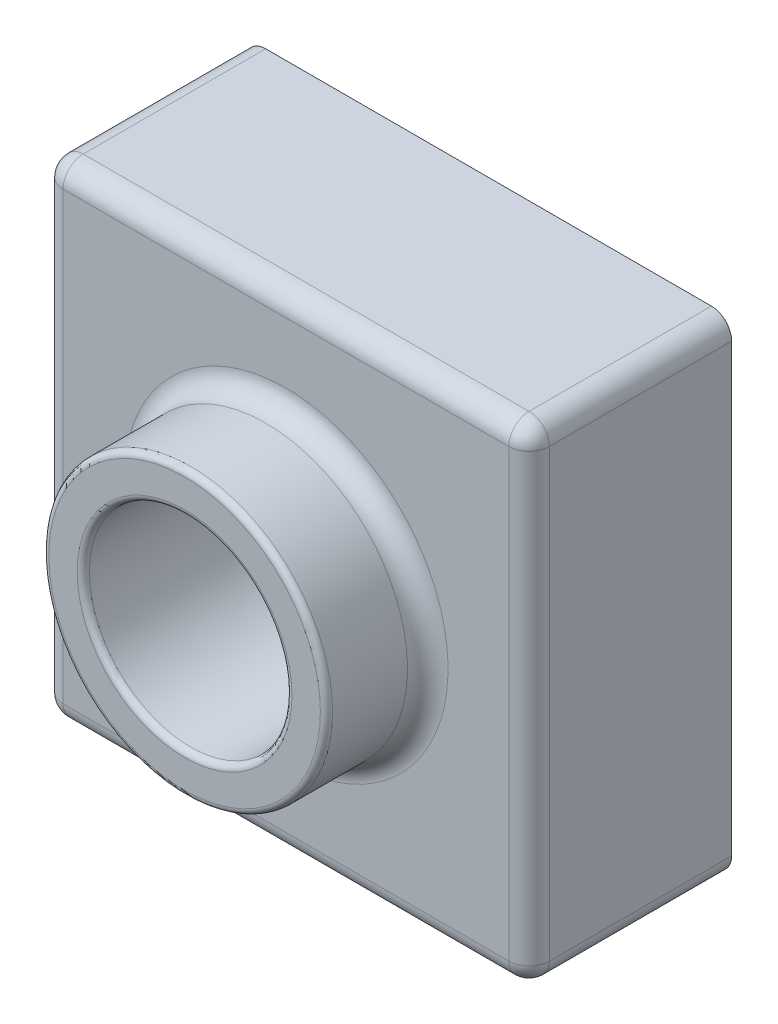
ISO-10303-21;
HEADER;
FILE_DESCRIPTION(('STEP AP214'),'2;1');
FILE_NAME('part.step','',(''),(''),'','','');
FILE_SCHEMA(('AUTOMOTIVE_DESIGN { 1 0 10303 214 1 1 1 1 }'));
ENDSEC;
DATA;
#1=APPLICATION_CONTEXT('core data for automotive mechanical design processes');
#2=APPLICATION_PROTOCOL_DEFINITION('international standard','automotive_design',2000,#1);
#3=PRODUCT_CONTEXT('',#1,'mechanical');
#4=PRODUCT('Part','Part','',(#3));
#5=PRODUCT_RELATED_PRODUCT_CATEGORY('part','',(#4));
#6=PRODUCT_DEFINITION_FORMATION('','',#4);
#7=PRODUCT_DEFINITION_CONTEXT('part definition',#1,'design');
#8=PRODUCT_DEFINITION('design','',#6,#7);
#9=PRODUCT_DEFINITION_SHAPE('','',#8);
#10=(LENGTH_UNIT() NAMED_UNIT(*) SI_UNIT(.MILLI.,.METRE.));
#11=(NAMED_UNIT(*) PLANE_ANGLE_UNIT() SI_UNIT($,.RADIAN.));
#12=(NAMED_UNIT(*) SI_UNIT($,.STERADIAN.) SOLID_ANGLE_UNIT());
#13=UNCERTAINTY_MEASURE_WITH_UNIT(LENGTH_MEASURE(1.E-05),#10,'distance_accuracy_value','');
#14=(GEOMETRIC_REPRESENTATION_CONTEXT(3) GLOBAL_UNCERTAINTY_ASSIGNED_CONTEXT((#13)) GLOBAL_UNIT_ASSIGNED_CONTEXT((#10,
#11,#12)) REPRESENTATION_CONTEXT('',''));
#15=CARTESIAN_POINT('',(0.,0.,0.));
#16=DIRECTION('',(0.,0.,1.));
#17=DIRECTION('',(1.,0.,0.));
#18=AXIS2_PLACEMENT_3D('',#15,#16,#17);
#19=CARTESIAN_POINT('',(0.,0.,50.));
#20=DIRECTION('',(0.,0.,-1.));
#21=DIRECTION('',(-1.,0.,0.));
#22=AXIS2_PLACEMENT_3D('',#19,#20,#21);
#23=PLANE('',#22);
#24=DIRECTION('',(0.,1.,0.));
#25=VECTOR('',#24,1.);
#26=CARTESIAN_POINT('',(115.,0.,50.));
#27=LINE('',#26,#25);
#28=CARTESIAN_POINT('',(115.,5.,50.));
#29=VERTEX_POINT('',#28);
#30=CARTESIAN_POINT('',(115.,115.,50.));
#31=VERTEX_POINT('',#30);
#32=EDGE_CURVE('E143',#29,#31,#27,.T.);
#33=ORIENTED_EDGE('',*,*,#32,.T.);
#34=DIRECTION('',(-1.,0.,0.));
#35=VECTOR('',#34,1.);
#36=CARTESIAN_POINT('',(0.,115.,50.));
#37=LINE('',#36,#35);
#38=CARTESIAN_POINT('',(4.99999999999997,115.,50.));
#39=VERTEX_POINT('',#38);
#40=EDGE_CURVE('E115',#31,#39,#37,.T.);
#41=ORIENTED_EDGE('',*,*,#40,.T.);
#42=DIRECTION('',(0.,-1.,0.));
#43=VECTOR('',#42,1.);
#44=CARTESIAN_POINT('',(5.,0.,50.));
#45=LINE('',#44,#43);
#46=CARTESIAN_POINT('',(5.,5.,50.));
#47=VERTEX_POINT('',#46);
#48=EDGE_CURVE('E132',#39,#47,#45,.T.);
#49=ORIENTED_EDGE('',*,*,#48,.T.);
#50=DIRECTION('',(1.,0.,0.));
#51=VECTOR('',#50,1.);
#52=CARTESIAN_POINT('',(0.,5.,50.));
#53=LINE('',#52,#51);
#54=EDGE_CURVE('E138',#47,#29,#53,.T.);
#55=ORIENTED_EDGE('',*,*,#54,.T.);
#56=EDGE_LOOP('',(#33,#41,#49,#55));
#57=FACE_BOUND('',#56,.T.);
#58=CARTESIAN_POINT('',(60.,60.,50.));
#59=DIRECTION('',(0.,0.,-1.));
#60=DIRECTION('',(-1.,0.,0.));
#61=AXIS2_PLACEMENT_3D('',#58,#59,#60);
#62=CIRCLE('',#61,40.);
#63=CARTESIAN_POINT('',(20.,60.,50.));
#64=VERTEX_POINT('',#63);
#65=EDGE_CURVE('E139',#64,#64,#62,.T.);
#66=ORIENTED_EDGE('',*,*,#65,.T.);
#67=EDGE_LOOP('',(#66));
#68=FACE_BOUND('',#67,.T.);
#69=ADVANCED_FACE('F33',(#57,#68),#23,.F.);
#70=CARTESIAN_POINT('',(0.,0.,50.));
#71=DIRECTION('',(1.,0.,0.));
#72=DIRECTION('',(0.,1.,0.));
#73=AXIS2_PLACEMENT_3D('',#70,#71,#72);
#74=PLANE('',#73);
#75=DIRECTION('',(0.,-1.,0.));
#76=VECTOR('',#75,1.);
#77=CARTESIAN_POINT('',(0.,0.,0.));
#78=LINE('',#77,#76);
#79=CARTESIAN_POINT('',(0.,115.,0.));
#80=VERTEX_POINT('',#79);
#81=CARTESIAN_POINT('',(0.,5.,0.));
#82=VERTEX_POINT('',#81);
#83=EDGE_CURVE('E240',#80,#82,#78,.T.);
#84=ORIENTED_EDGE('',*,*,#83,.T.);
#85=DIRECTION('',(0.,0.,-1.));
#86=VECTOR('',#85,1.);
#87=CARTESIAN_POINT('',(0.,5.,50.));
#88=LINE('',#87,#86);
#89=CARTESIAN_POINT('',(0.,5.,45.));
#90=VERTEX_POINT('',#89);
#91=EDGE_CURVE('E48',#82,#90,#88,.F.);
#92=ORIENTED_EDGE('',*,*,#91,.T.);
#93=DIRECTION('',(0.,-1.,0.));
#94=VECTOR('',#93,1.);
#95=CARTESIAN_POINT('',(0.,0.,45.));
#96=LINE('',#95,#94);
#97=CARTESIAN_POINT('',(0.,115.,45.));
#98=VERTEX_POINT('',#97);
#99=EDGE_CURVE('E53',#90,#98,#96,.F.);
#100=ORIENTED_EDGE('',*,*,#99,.T.);
#101=DIRECTION('',(0.,0.,-1.));
#102=VECTOR('',#101,1.);
#103=CARTESIAN_POINT('',(0.,115.,50.));
#104=LINE('',#103,#102);
#105=EDGE_CURVE('E166',#98,#80,#104,.T.);
#106=ORIENTED_EDGE('',*,*,#105,.T.);
#107=EDGE_LOOP('',(#84,#92,#100,#106));
#108=FACE_BOUND('',#107,.T.);
#109=ADVANCED_FACE('F283',(#108),#74,.F.);
#110=CARTESIAN_POINT('',(0.,0.,50.));
#111=DIRECTION('',(0.,1.,0.));
#112=DIRECTION('',(0.,0.,1.));
#113=AXIS2_PLACEMENT_3D('',#110,#111,#112);
#114=PLANE('',#113);
#115=DIRECTION('',(1.,0.,0.));
#116=VECTOR('',#115,1.);
#117=CARTESIAN_POINT('',(0.,0.,45.));
#118=LINE('',#117,#116);
#119=CARTESIAN_POINT('',(115.,0.,45.));
#120=VERTEX_POINT('',#119);
#121=CARTESIAN_POINT('',(5.,0.,45.));
#122=VERTEX_POINT('',#121);
#123=EDGE_CURVE('E162',#120,#122,#118,.F.);
#124=ORIENTED_EDGE('',*,*,#123,.T.);
#125=DIRECTION('',(0.,0.,-1.));
#126=VECTOR('',#125,1.);
#127=CARTESIAN_POINT('',(5.,0.,50.));
#128=LINE('',#127,#126);
#129=CARTESIAN_POINT('',(5.,0.,0.));
#130=VERTEX_POINT('',#129);
#131=EDGE_CURVE('E164',#122,#130,#128,.T.);
#132=ORIENTED_EDGE('',*,*,#131,.T.);
#133=DIRECTION('',(1.,0.,0.));
#134=VECTOR('',#133,1.);
#135=CARTESIAN_POINT('',(0.,0.,0.));
#136=LINE('',#135,#134);
#137=CARTESIAN_POINT('',(115.,0.,0.));
#138=VERTEX_POINT('',#137);
#139=EDGE_CURVE('E242',#130,#138,#136,.T.);
#140=ORIENTED_EDGE('',*,*,#139,.T.);
#141=DIRECTION('',(0.,0.,-1.));
#142=VECTOR('',#141,1.);
#143=CARTESIAN_POINT('',(115.,0.,50.));
#144=LINE('',#143,#142);
#145=EDGE_CURVE('E160',#138,#120,#144,.F.);
#146=ORIENTED_EDGE('',*,*,#145,.T.);
#147=EDGE_LOOP('',(#124,#132,#140,#146));
#148=FACE_BOUND('',#147,.T.);
#149=ADVANCED_FACE('F306',(#148),#114,.F.);
#150=CARTESIAN_POINT('',(120.,0.,50.));
#151=DIRECTION('',(-1.,0.,0.));
#152=DIRECTION('',(0.,-1.,0.));
#153=AXIS2_PLACEMENT_3D('',#150,#151,#152);
#154=PLANE('',#153);
#155=DIRECTION('',(0.,1.,0.));
#156=VECTOR('',#155,1.);
#157=CARTESIAN_POINT('',(120.,0.,45.));
#158=LINE('',#157,#156);
#159=CARTESIAN_POINT('',(120.,115.,45.));
#160=VERTEX_POINT('',#159);
#161=CARTESIAN_POINT('',(120.,5.,45.));
#162=VERTEX_POINT('',#161);
#163=EDGE_CURVE('E156',#160,#162,#158,.F.);
#164=ORIENTED_EDGE('',*,*,#163,.T.);
#165=DIRECTION('',(0.,0.,-1.));
#166=VECTOR('',#165,1.);
#167=CARTESIAN_POINT('',(120.,5.,50.));
#168=LINE('',#167,#166);
#169=CARTESIAN_POINT('',(120.,5.,0.));
#170=VERTEX_POINT('',#169);
#171=EDGE_CURVE('E158',#162,#170,#168,.T.);
#172=ORIENTED_EDGE('',*,*,#171,.T.);
#173=DIRECTION('',(0.,1.,0.));
#174=VECTOR('',#173,1.);
#175=CARTESIAN_POINT('',(120.,0.,0.));
#176=LINE('',#175,#174);
#177=CARTESIAN_POINT('',(120.,115.,0.));
#178=VERTEX_POINT('',#177);
#179=EDGE_CURVE('E247',#170,#178,#176,.T.);
#180=ORIENTED_EDGE('',*,*,#179,.T.);
#181=DIRECTION('',(0.,0.,-1.));
#182=VECTOR('',#181,1.);
#183=CARTESIAN_POINT('',(120.,115.,50.));
#184=LINE('',#183,#182);
#185=EDGE_CURVE('E154',#178,#160,#184,.F.);
#186=ORIENTED_EDGE('',*,*,#185,.T.);
#187=EDGE_LOOP('',(#164,#172,#180,#186));
#188=FACE_BOUND('',#187,.T.);
#189=ADVANCED_FACE('F314',(#188),#154,.F.);
#190=CARTESIAN_POINT('',(0.,120.,50.));
#191=DIRECTION('',(0.,-1.,0.));
#192=DIRECTION('',(0.,0.,-1.));
#193=AXIS2_PLACEMENT_3D('',#190,#191,#192);
#194=PLANE('',#193);
#195=DIRECTION('',(-1.,0.,0.));
#196=VECTOR('',#195,1.);
#197=CARTESIAN_POINT('',(0.,120.,45.));
#198=LINE('',#197,#196);
#199=CARTESIAN_POINT('',(4.99999999999997,120.,45.));
#200=VERTEX_POINT('',#199);
#201=CARTESIAN_POINT('',(115.,120.,45.));
#202=VERTEX_POINT('',#201);
#203=EDGE_CURVE('E117',#200,#202,#198,.F.);
#204=ORIENTED_EDGE('',*,*,#203,.T.);
#205=DIRECTION('',(0.,0.,-1.));
#206=VECTOR('',#205,1.);
#207=CARTESIAN_POINT('',(115.,120.,50.));
#208=LINE('',#207,#206);
#209=CARTESIAN_POINT('',(115.,120.,0.));
#210=VERTEX_POINT('',#209);
#211=EDGE_CURVE('E152',#202,#210,#208,.T.);
#212=ORIENTED_EDGE('',*,*,#211,.T.);
#213=DIRECTION('',(-1.,0.,0.));
#214=VECTOR('',#213,1.);
#215=CARTESIAN_POINT('',(0.,120.,0.));
#216=LINE('',#215,#214);
#217=CARTESIAN_POINT('',(4.99999999999997,120.,0.));
#218=VERTEX_POINT('',#217);
#219=EDGE_CURVE('E250',#210,#218,#216,.T.);
#220=ORIENTED_EDGE('',*,*,#219,.T.);
#221=DIRECTION('',(0.,0.,-1.));
#222=VECTOR('',#221,1.);
#223=CARTESIAN_POINT('',(4.99999999999997,120.,50.));
#224=LINE('',#223,#222);
#225=EDGE_CURVE('E145',#218,#200,#224,.F.);
#226=ORIENTED_EDGE('',*,*,#225,.T.);
#227=EDGE_LOOP('',(#204,#212,#220,#226));
#228=FACE_BOUND('',#227,.T.);
#229=ADVANCED_FACE('F277',(#228),#194,.F.);
#230=CARTESIAN_POINT('',(0.,0.,0.));
#231=DIRECTION('',(0.,0.,-1.));
#232=DIRECTION('',(-1.,0.,0.));
#233=AXIS2_PLACEMENT_3D('',#230,#231,#232);
#234=PLANE('',#233);
#235=CARTESIAN_POINT('',(60.,60.,0.));
#236=DIRECTION('',(0.,0.,1.));
#237=DIRECTION('',(1.,0.,0.));
#238=AXIS2_PLACEMENT_3D('',#235,#236,#237);
#239=CIRCLE('',#238,25.);
#240=CARTESIAN_POINT('',(85.,60.,0.));
#241=VERTEX_POINT('',#240);
#242=EDGE_CURVE('E205',#241,#241,#239,.T.);
#243=ORIENTED_EDGE('',*,*,#242,.T.);
#244=EDGE_LOOP('',(#243));
#245=FACE_BOUND('',#244,.T.);
#246=ORIENTED_EDGE('',*,*,#139,.F.);
#247=CARTESIAN_POINT('',(5.,5.,0.));
#248=DIRECTION('',(0.,0.,-1.));
#249=DIRECTION('',(-1.,0.,0.));
#250=AXIS2_PLACEMENT_3D('',#247,#248,#249);
#251=CIRCLE('',#250,5.);
#252=EDGE_CURVE('E176',#130,#82,#251,.T.);
#253=ORIENTED_EDGE('',*,*,#252,.T.);
#254=ORIENTED_EDGE('',*,*,#83,.F.);
#255=CARTESIAN_POINT('',(4.99999999999997,115.,0.));
#256=DIRECTION('',(0.,0.,-1.));
#257=DIRECTION('',(-1.,0.,0.));
#258=AXIS2_PLACEMENT_3D('',#255,#256,#257);
#259=CIRCLE('',#258,5.);
#260=EDGE_CURVE('E170',#80,#218,#259,.T.);
#261=ORIENTED_EDGE('',*,*,#260,.T.);
#262=ORIENTED_EDGE('',*,*,#219,.F.);
#263=CARTESIAN_POINT('',(115.,115.,0.));
#264=DIRECTION('',(0.,0.,-1.));
#265=DIRECTION('',(-1.,0.,0.));
#266=AXIS2_PLACEMENT_3D('',#263,#264,#265);
#267=CIRCLE('',#266,5.);
#268=EDGE_CURVE('E172',#210,#178,#267,.T.);
#269=ORIENTED_EDGE('',*,*,#268,.T.);
#270=ORIENTED_EDGE('',*,*,#179,.F.);
#271=CARTESIAN_POINT('',(115.,5.,0.));
#272=DIRECTION('',(0.,0.,-1.));
#273=DIRECTION('',(-1.,0.,0.));
#274=AXIS2_PLACEMENT_3D('',#271,#272,#273);
#275=CIRCLE('',#274,5.);
#276=EDGE_CURVE('E174',#170,#138,#275,.T.);
#277=ORIENTED_EDGE('',*,*,#276,.T.);
#278=EDGE_LOOP('',(#246,#253,#254,#261,#262,#269,#270,#277));
#279=FACE_BOUND('',#278,.T.);
#280=ADVANCED_FACE('F286',(#245,#279),#234,.T.);
#281=CARTESIAN_POINT('',(60.,60.,75.));
#282=DIRECTION('',(0.,0.,-1.));
#283=DIRECTION('',(-1.,0.,0.));
#284=AXIS2_PLACEMENT_3D('',#281,#282,#283);
#285=CYLINDRICAL_SURFACE('',#284,35.);
#286=CARTESIAN_POINT('',(60.,60.,73.5));
#287=DIRECTION('',(0.,0.,1.));
#288=DIRECTION('',(1.,0.,0.));
#289=AXIS2_PLACEMENT_3D('',#286,#287,#288);
#290=CIRCLE('',#289,35.);
#291=CARTESIAN_POINT('',(95.,60.,73.5));
#292=VERTEX_POINT('',#291);
#293=EDGE_CURVE('E41',#292,#292,#290,.F.);
#294=ORIENTED_EDGE('',*,*,#293,.T.);
#295=EDGE_LOOP('',(#294));
#296=FACE_BOUND('',#295,.T.);
#297=CARTESIAN_POINT('',(60.,60.,55.));
#298=DIRECTION('',(0.,0.,-1.));
#299=DIRECTION('',(-1.,0.,0.));
#300=AXIS2_PLACEMENT_3D('',#297,#298,#299);
#301=CIRCLE('',#300,35.);
#302=CARTESIAN_POINT('',(25.,60.,55.));
#303=VERTEX_POINT('',#302);
#304=EDGE_CURVE('E178',#303,#303,#301,.F.);
#305=ORIENTED_EDGE('',*,*,#304,.T.);
#306=EDGE_LOOP('',(#305));
#307=FACE_BOUND('',#306,.T.);
#308=ADVANCED_FACE('F213',(#296,#307),#285,.T.);
#309=CARTESIAN_POINT('',(60.,60.,75.));
#310=DIRECTION('',(0.,0.,1.));
#311=DIRECTION('',(1.,0.,0.));
#312=AXIS2_PLACEMENT_3D('',#309,#310,#311);
#313=PLANE('',#312);
#314=CARTESIAN_POINT('',(60.,60.,75.));
#315=DIRECTION('',(0.,0.,1.));
#316=DIRECTION('',(1.,0.,0.));
#317=AXIS2_PLACEMENT_3D('',#314,#315,#316);
#318=CIRCLE('',#317,33.5);
#319=CARTESIAN_POINT('',(93.5,60.,75.));
#320=VERTEX_POINT('',#319);
#321=EDGE_CURVE('E208',#320,#320,#318,.T.);
#322=ORIENTED_EDGE('',*,*,#321,.T.);
#323=EDGE_LOOP('',(#322));
#324=FACE_BOUND('',#323,.T.);
#325=CARTESIAN_POINT('',(60.,60.,75.));
#326=DIRECTION('',(0.,0.,1.));
#327=DIRECTION('',(1.,0.,0.));
#328=AXIS2_PLACEMENT_3D('',#325,#326,#327);
#329=CIRCLE('',#328,26.5);
#330=CARTESIAN_POINT('',(86.5,60.,75.));
#331=VERTEX_POINT('',#330);
#332=EDGE_CURVE('E180',#331,#331,#329,.F.);
#333=ORIENTED_EDGE('',*,*,#332,.T.);
#334=EDGE_LOOP('',(#333));
#335=FACE_BOUND('',#334,.T.);
#336=ADVANCED_FACE('F222',(#324,#335),#313,.T.);
#337=CARTESIAN_POINT('',(60.,60.,0.));
#338=DIRECTION('',(0.,0.,1.));
#339=DIRECTION('',(1.,0.,0.));
#340=AXIS2_PLACEMENT_3D('',#337,#338,#339);
#341=CYLINDRICAL_SURFACE('',#340,25.);
#342=CARTESIAN_POINT('',(60.,60.,73.5));
#343=DIRECTION('',(0.,0.,1.));
#344=DIRECTION('',(1.,0.,0.));
#345=AXIS2_PLACEMENT_3D('',#342,#343,#344);
#346=CIRCLE('',#345,25.);
#347=CARTESIAN_POINT('',(85.,60.,73.5));
#348=VERTEX_POINT('',#347);
#349=EDGE_CURVE('E11',#348,#348,#346,.T.);
#350=ORIENTED_EDGE('',*,*,#349,.T.);
#351=EDGE_LOOP('',(#350));
#352=FACE_BOUND('',#351,.T.);
#353=ORIENTED_EDGE('',*,*,#242,.F.);
#354=EDGE_LOOP('',(#353));
#355=FACE_BOUND('',#354,.T.);
#356=ADVANCED_FACE('F225',(#352,#355),#341,.F.);
#357=CARTESIAN_POINT('',(115.,5.,50.));
#358=DIRECTION('',(0.,0.,-1.));
#359=DIRECTION('',(-1.,0.,0.));
#360=AXIS2_PLACEMENT_3D('',#357,#358,#359);
#361=CYLINDRICAL_SURFACE('',#360,5.);
#362=ORIENTED_EDGE('',*,*,#276,.F.);
#363=ORIENTED_EDGE('',*,*,#171,.F.);
#364=CARTESIAN_POINT('',(115.,5.,45.));
#365=DIRECTION('',(0.,0.,1.));
#366=DIRECTION('',(1.,0.,0.));
#367=AXIS2_PLACEMENT_3D('',#364,#365,#366);
#368=CIRCLE('',#367,5.);
#369=EDGE_CURVE('E202',#120,#162,#368,.T.);
#370=ORIENTED_EDGE('',*,*,#369,.F.);
#371=ORIENTED_EDGE('',*,*,#145,.F.);
#372=EDGE_LOOP('',(#362,#363,#370,#371));
#373=FACE_BOUND('',#372,.T.);
#374=ADVANCED_FACE('F235',(#373),#361,.T.);
#375=CARTESIAN_POINT('',(0.,5.,45.));
#376=DIRECTION('',(1.,0.,0.));
#377=DIRECTION('',(0.,0.,-1.));
#378=AXIS2_PLACEMENT_3D('',#375,#376,#377);
#379=CYLINDRICAL_SURFACE('',#378,5.);
#380=CARTESIAN_POINT('',(5.,5.,45.));
#381=DIRECTION('',(-1.,0.,0.));
#382=DIRECTION('',(0.,0.,1.));
#383=AXIS2_PLACEMENT_3D('',#380,#381,#382);
#384=CIRCLE('',#383,5.);
#385=EDGE_CURVE('E196',#122,#47,#384,.T.);
#386=ORIENTED_EDGE('',*,*,#385,.F.);
#387=ORIENTED_EDGE('',*,*,#123,.F.);
#388=CARTESIAN_POINT('',(115.,5.,45.));
#389=DIRECTION('',(1.,0.,0.));
#390=DIRECTION('',(0.,0.,-1.));
#391=AXIS2_PLACEMENT_3D('',#388,#389,#390);
#392=CIRCLE('',#391,5.);
#393=EDGE_CURVE('E199',#29,#120,#392,.T.);
#394=ORIENTED_EDGE('',*,*,#393,.F.);
#395=ORIENTED_EDGE('',*,*,#54,.F.);
#396=EDGE_LOOP('',(#386,#387,#394,#395));
#397=FACE_BOUND('',#396,.T.);
#398=ADVANCED_FACE('F259',(#397),#379,.T.);
#399=CARTESIAN_POINT('',(5.,5.,50.));
#400=DIRECTION('',(0.,0.,-1.));
#401=DIRECTION('',(-1.,0.,0.));
#402=AXIS2_PLACEMENT_3D('',#399,#400,#401);
#403=CYLINDRICAL_SURFACE('',#402,5.);
#404=ORIENTED_EDGE('',*,*,#252,.F.);
#405=ORIENTED_EDGE('',*,*,#131,.F.);
#406=CARTESIAN_POINT('',(5.,5.,45.));
#407=DIRECTION('',(0.,0.,1.));
#408=DIRECTION('',(1.,0.,0.));
#409=AXIS2_PLACEMENT_3D('',#406,#407,#408);
#410=CIRCLE('',#409,5.);
#411=EDGE_CURVE('E193',#90,#122,#410,.T.);
#412=ORIENTED_EDGE('',*,*,#411,.F.);
#413=ORIENTED_EDGE('',*,*,#91,.F.);
#414=EDGE_LOOP('',(#404,#405,#412,#413));
#415=FACE_BOUND('',#414,.T.);
#416=ADVANCED_FACE('F290',(#415),#403,.T.);
#417=CARTESIAN_POINT('',(115.,5.,45.));
#418=DIRECTION('',(0.,0.,1.));
#419=DIRECTION('',(1.,0.,0.));
#420=AXIS2_PLACEMENT_3D('',#417,#418,#419);
#421=SPHERICAL_SURFACE('',#420,5.);
#422=ORIENTED_EDGE('',*,*,#393,.T.);
#423=ORIENTED_EDGE('',*,*,#369,.T.);
#424=CARTESIAN_POINT('',(115.,5.,45.));
#425=DIRECTION('',(0.,-1.,0.));
#426=DIRECTION('',(1.,0.,0.));
#427=AXIS2_PLACEMENT_3D('',#424,#425,#426);
#428=CIRCLE('',#427,5.);
#429=EDGE_CURVE('E190',#29,#162,#428,.F.);
#430=ORIENTED_EDGE('',*,*,#429,.F.);
#431=EDGE_LOOP('',(#422,#423,#430));
#432=FACE_BOUND('',#431,.T.);
#433=ADVANCED_FACE('F262',(#432),#421,.T.);
#434=CARTESIAN_POINT('',(5.,5.,45.));
#435=DIRECTION('',(0.,0.,1.));
#436=DIRECTION('',(1.,0.,0.));
#437=AXIS2_PLACEMENT_3D('',#434,#435,#436);
#438=SPHERICAL_SURFACE('',#437,5.);
#439=ORIENTED_EDGE('',*,*,#411,.T.);
#440=ORIENTED_EDGE('',*,*,#385,.T.);
#441=CARTESIAN_POINT('',(5.,5.,45.));
#442=DIRECTION('',(0.,-1.,0.));
#443=DIRECTION('',(1.,0.,0.));
#444=AXIS2_PLACEMENT_3D('',#441,#442,#443);
#445=CIRCLE('',#444,5.);
#446=EDGE_CURVE('E135',#90,#47,#445,.F.);
#447=ORIENTED_EDGE('',*,*,#446,.F.);
#448=EDGE_LOOP('',(#439,#440,#447));
#449=FACE_BOUND('',#448,.T.);
#450=ADVANCED_FACE('F292',(#449),#438,.T.);
#451=CARTESIAN_POINT('',(115.,115.,50.));
#452=DIRECTION('',(0.,0.,-1.));
#453=DIRECTION('',(-1.,0.,0.));
#454=AXIS2_PLACEMENT_3D('',#451,#452,#453);
#455=CYLINDRICAL_SURFACE('',#454,5.);
#456=ORIENTED_EDGE('',*,*,#268,.F.);
#457=ORIENTED_EDGE('',*,*,#211,.F.);
#458=CARTESIAN_POINT('',(115.,115.,45.));
#459=DIRECTION('',(0.,0.,1.));
#460=DIRECTION('',(1.,0.,0.));
#461=AXIS2_PLACEMENT_3D('',#458,#459,#460);
#462=CIRCLE('',#461,5.);
#463=EDGE_CURVE('E186',#160,#202,#462,.T.);
#464=ORIENTED_EDGE('',*,*,#463,.F.);
#465=ORIENTED_EDGE('',*,*,#185,.F.);
#466=EDGE_LOOP('',(#456,#457,#464,#465));
#467=FACE_BOUND('',#466,.T.);
#468=ADVANCED_FACE('F274',(#467),#455,.T.);
#469=CARTESIAN_POINT('',(115.,0.,45.));
#470=DIRECTION('',(0.,1.,0.));
#471=DIRECTION('',(-1.,0.,0.));
#472=AXIS2_PLACEMENT_3D('',#469,#470,#471);
#473=CYLINDRICAL_SURFACE('',#472,5.);
#474=ORIENTED_EDGE('',*,*,#429,.T.);
#475=ORIENTED_EDGE('',*,*,#163,.F.);
#476=CARTESIAN_POINT('',(115.,115.,45.));
#477=DIRECTION('',(0.,1.,0.));
#478=DIRECTION('',(0.,0.,1.));
#479=AXIS2_PLACEMENT_3D('',#476,#477,#478);
#480=CIRCLE('',#479,5.);
#481=EDGE_CURVE('E129',#31,#160,#480,.T.);
#482=ORIENTED_EDGE('',*,*,#481,.F.);
#483=ORIENTED_EDGE('',*,*,#32,.F.);
#484=EDGE_LOOP('',(#474,#475,#482,#483));
#485=FACE_BOUND('',#484,.T.);
#486=ADVANCED_FACE('F265',(#485),#473,.T.);
#487=CARTESIAN_POINT('',(5.,0.,45.));
#488=DIRECTION('',(0.,-1.,0.));
#489=DIRECTION('',(1.,0.,0.));
#490=AXIS2_PLACEMENT_3D('',#487,#488,#489);
#491=CYLINDRICAL_SURFACE('',#490,5.);
#492=ORIENTED_EDGE('',*,*,#446,.T.);
#493=ORIENTED_EDGE('',*,*,#48,.F.);
#494=CARTESIAN_POINT('',(4.99999999999997,115.,45.));
#495=DIRECTION('',(0.,1.,0.));
#496=DIRECTION('',(0.,0.,1.));
#497=AXIS2_PLACEMENT_3D('',#494,#495,#496);
#498=CIRCLE('',#497,5.);
#499=EDGE_CURVE('E123',#98,#39,#498,.T.);
#500=ORIENTED_EDGE('',*,*,#499,.F.);
#501=ORIENTED_EDGE('',*,*,#99,.F.);
#502=EDGE_LOOP('',(#492,#493,#500,#501));
#503=FACE_BOUND('',#502,.T.);
#504=ADVANCED_FACE('F133',(#503),#491,.T.);
#505=CARTESIAN_POINT('',(4.99999999999997,115.,50.));
#506=DIRECTION('',(0.,0.,-1.));
#507=DIRECTION('',(-1.,0.,0.));
#508=AXIS2_PLACEMENT_3D('',#505,#506,#507);
#509=CYLINDRICAL_SURFACE('',#508,5.);
#510=ORIENTED_EDGE('',*,*,#260,.F.);
#511=ORIENTED_EDGE('',*,*,#105,.F.);
#512=CARTESIAN_POINT('',(4.99999999999997,115.,45.));
#513=DIRECTION('',(0.,0.,1.));
#514=DIRECTION('',(1.,0.,0.));
#515=AXIS2_PLACEMENT_3D('',#512,#513,#514);
#516=CIRCLE('',#515,5.);
#517=EDGE_CURVE('E127',#200,#98,#516,.T.);
#518=ORIENTED_EDGE('',*,*,#517,.F.);
#519=ORIENTED_EDGE('',*,*,#225,.F.);
#520=EDGE_LOOP('',(#510,#511,#518,#519));
#521=FACE_BOUND('',#520,.T.);
#522=ADVANCED_FACE('F281',(#521),#509,.T.);
#523=CARTESIAN_POINT('',(115.,115.,45.));
#524=DIRECTION('',(0.,0.,1.));
#525=DIRECTION('',(1.,0.,0.));
#526=AXIS2_PLACEMENT_3D('',#523,#524,#525);
#527=SPHERICAL_SURFACE('',#526,5.);
#528=ORIENTED_EDGE('',*,*,#481,.T.);
#529=ORIENTED_EDGE('',*,*,#463,.T.);
#530=CARTESIAN_POINT('',(115.,115.,45.));
#531=DIRECTION('',(1.,0.,0.));
#532=DIRECTION('',(0.,0.,-1.));
#533=AXIS2_PLACEMENT_3D('',#530,#531,#532);
#534=CIRCLE('',#533,5.);
#535=EDGE_CURVE('E120',#31,#202,#534,.F.);
#536=ORIENTED_EDGE('',*,*,#535,.F.);
#537=EDGE_LOOP('',(#528,#529,#536));
#538=FACE_BOUND('',#537,.T.);
#539=ADVANCED_FACE('F269',(#538),#527,.T.);
#540=CARTESIAN_POINT('',(4.99999999999997,115.,45.));
#541=DIRECTION('',(0.,0.,1.));
#542=DIRECTION('',(1.,0.,0.));
#543=AXIS2_PLACEMENT_3D('',#540,#541,#542);
#544=SPHERICAL_SURFACE('',#543,5.);
#545=ORIENTED_EDGE('',*,*,#517,.T.);
#546=ORIENTED_EDGE('',*,*,#499,.T.);
#547=CARTESIAN_POINT('',(4.99999999999997,115.,45.));
#548=DIRECTION('',(-1.,0.,0.));
#549=DIRECTION('',(0.,0.,1.));
#550=AXIS2_PLACEMENT_3D('',#547,#548,#549);
#551=CIRCLE('',#550,5.);
#552=EDGE_CURVE('E111',#200,#39,#551,.F.);
#553=ORIENTED_EDGE('',*,*,#552,.F.);
#554=EDGE_LOOP('',(#545,#546,#553));
#555=FACE_BOUND('',#554,.T.);
#556=ADVANCED_FACE('F125',(#555),#544,.T.);
#557=CARTESIAN_POINT('',(0.,115.,45.));
#558=DIRECTION('',(-1.,0.,0.));
#559=DIRECTION('',(0.,0.,1.));
#560=AXIS2_PLACEMENT_3D('',#557,#558,#559);
#561=CYLINDRICAL_SURFACE('',#560,5.);
#562=ORIENTED_EDGE('',*,*,#535,.T.);
#563=ORIENTED_EDGE('',*,*,#203,.F.);
#564=ORIENTED_EDGE('',*,*,#552,.T.);
#565=ORIENTED_EDGE('',*,*,#40,.F.);
#566=EDGE_LOOP('',(#562,#563,#564,#565));
#567=FACE_BOUND('',#566,.T.);
#568=ADVANCED_FACE('F113',(#567),#561,.T.);
#569=CARTESIAN_POINT('',(60.,60.,55.));
#570=DIRECTION('',(0.,0.,-1.));
#571=DIRECTION('',(-1.,0.,0.));
#572=AXIS2_PLACEMENT_3D('',#569,#570,#571);
#573=TOROIDAL_SURFACE('',#572,40.,5.);
#574=ORIENTED_EDGE('',*,*,#65,.F.);
#575=EDGE_LOOP('',(#574));
#576=FACE_BOUND('',#575,.T.);
#577=ORIENTED_EDGE('',*,*,#304,.F.);
#578=EDGE_LOOP('',(#577));
#579=FACE_BOUND('',#578,.T.);
#580=ADVANCED_FACE('F219',(#576,#579),#573,.F.);
#581=CARTESIAN_POINT('',(60.,60.,73.5));
#582=DIRECTION('',(0.,0.,1.));
#583=DIRECTION('',(1.,0.,0.));
#584=AXIS2_PLACEMENT_3D('',#581,#582,#583);
#585=TOROIDAL_SURFACE('',#584,33.5,1.5);
#586=ORIENTED_EDGE('',*,*,#293,.F.);
#587=EDGE_LOOP('',(#586));
#588=FACE_BOUND('',#587,.T.);
#589=ORIENTED_EDGE('',*,*,#321,.F.);
#590=EDGE_LOOP('',(#589));
#591=FACE_BOUND('',#590,.T.);
#592=ADVANCED_FACE('F216',(#588,#591),#585,.T.);
#593=CARTESIAN_POINT('',(60.,60.,73.5));
#594=DIRECTION('',(0.,0.,1.));
#595=DIRECTION('',(1.,0.,0.));
#596=AXIS2_PLACEMENT_3D('',#593,#594,#595);
#597=TOROIDAL_SURFACE('',#596,26.5,1.5);
#598=ORIENTED_EDGE('',*,*,#332,.F.);
#599=EDGE_LOOP('',(#598));
#600=FACE_BOUND('',#599,.T.);
#601=ORIENTED_EDGE('',*,*,#349,.F.);
#602=EDGE_LOOP('',(#601));
#603=FACE_BOUND('',#602,.T.);
#604=ADVANCED_FACE('F35',(#600,#603),#597,.T.);
#605=CLOSED_SHELL('',(#69,#109,#149,#189,#229,#280,#308,#336,#356,#374,#398,#416,#433,#450,#468,
#486,#504,#522,#539,#556,#568,#580,#592,#604));
#606=MANIFOLD_SOLID_BREP('B2',#605);
#607=ADVANCED_BREP_SHAPE_REPRESENTATION('',(#18,#606),#14);
#608=SHAPE_DEFINITION_REPRESENTATION(#9,#607);
ENDSEC;
END-ISO-10303-21;
